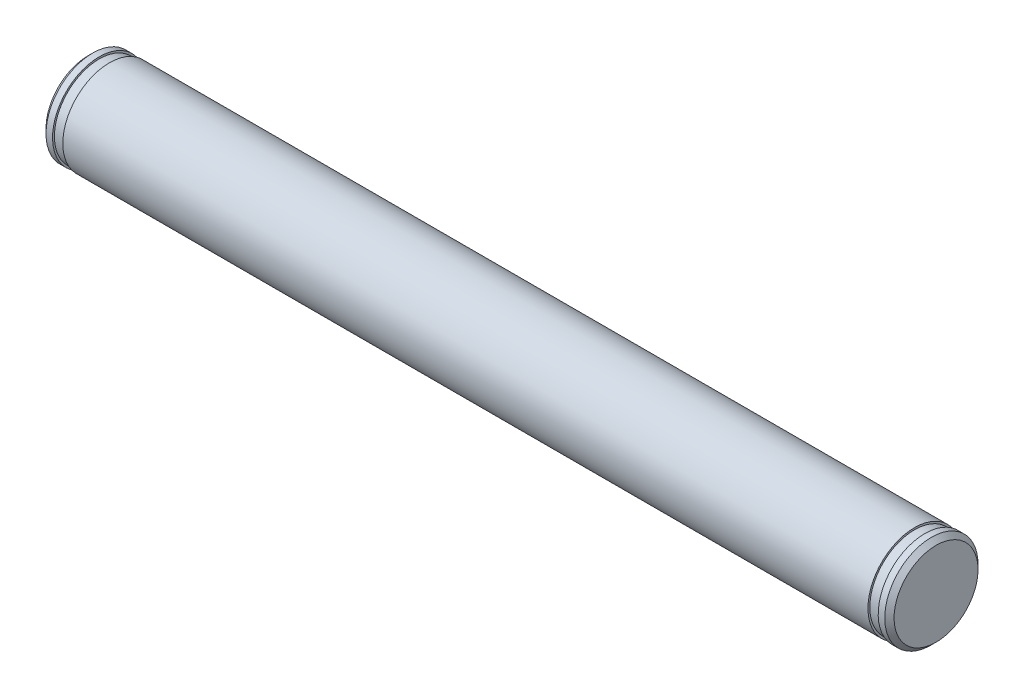
ISO-10303-21;
HEADER;
FILE_DESCRIPTION(('STEP AP214'),'2;1');
FILE_NAME('part.step','',(''),(''),'','','');
FILE_SCHEMA(('AUTOMOTIVE_DESIGN { 1 0 10303 214 1 1 1 1 }'));
ENDSEC;
DATA;
#1=APPLICATION_CONTEXT('core data for automotive mechanical design processes');
#2=APPLICATION_PROTOCOL_DEFINITION('international standard','automotive_design',2000,#1);
#3=PRODUCT_CONTEXT('',#1,'mechanical');
#4=PRODUCT('Part','Part','',(#3));
#5=PRODUCT_RELATED_PRODUCT_CATEGORY('part','',(#4));
#6=PRODUCT_DEFINITION_FORMATION('','',#4);
#7=PRODUCT_DEFINITION_CONTEXT('part definition',#1,'design');
#8=PRODUCT_DEFINITION('design','',#6,#7);
#9=PRODUCT_DEFINITION_SHAPE('','',#8);
#10=(LENGTH_UNIT() NAMED_UNIT(*) SI_UNIT(.MILLI.,.METRE.));
#11=(NAMED_UNIT(*) PLANE_ANGLE_UNIT() SI_UNIT($,.RADIAN.));
#12=(NAMED_UNIT(*) SI_UNIT($,.STERADIAN.) SOLID_ANGLE_UNIT());
#13=UNCERTAINTY_MEASURE_WITH_UNIT(LENGTH_MEASURE(1.E-05),#10,'distance_accuracy_value','');
#14=(GEOMETRIC_REPRESENTATION_CONTEXT(3) GLOBAL_UNCERTAINTY_ASSIGNED_CONTEXT((#13)) GLOBAL_UNIT_ASSIGNED_CONTEXT((#10,
#11,#12)) REPRESENTATION_CONTEXT('',''));
#15=CARTESIAN_POINT('',(0.,0.,0.));
#16=DIRECTION('',(0.,0.,1.));
#17=DIRECTION('',(1.,0.,0.));
#18=AXIS2_PLACEMENT_3D('',#15,#16,#17);
#19=CARTESIAN_POINT('',(-45.45,0.,0.));
#20=DIRECTION('',(-1.,0.,0.));
#21=DIRECTION('',(0.,-1.,0.));
#22=AXIS2_PLACEMENT_3D('',#19,#20,#21);
#23=PLANE('',#22);
#24=CARTESIAN_POINT('',(-45.45,0.,0.));
#25=DIRECTION('',(-1.,0.,0.));
#26=DIRECTION('',(0.,-1.,0.));
#27=AXIS2_PLACEMENT_3D('',#24,#25,#26);
#28=CIRCLE('',#27,4.49999999999999);
#29=CARTESIAN_POINT('',(-45.45,-4.49999999999999,0.));
#30=VERTEX_POINT('',#29);
#31=EDGE_CURVE('E10',#30,#30,#28,.T.);
#32=ORIENTED_EDGE('',*,*,#31,.T.);
#33=EDGE_LOOP('',(#32));
#34=FACE_BOUND('',#33,.T.);
#35=ADVANCED_FACE('F34',(#34),#23,.T.);
#36=CARTESIAN_POINT('',(45.45,0.,0.));
#37=DIRECTION('',(1.,0.,0.));
#38=DIRECTION('',(0.,1.,0.));
#39=AXIS2_PLACEMENT_3D('',#36,#37,#38);
#40=CYLINDRICAL_SURFACE('',#39,4.99999999999999);
#41=CARTESIAN_POINT('',(-44.95,0.,0.));
#42=DIRECTION('',(-1.,0.,0.));
#43=DIRECTION('',(0.,-1.,0.));
#44=AXIS2_PLACEMENT_3D('',#41,#42,#43);
#45=CIRCLE('',#44,4.99999999999999);
#46=CARTESIAN_POINT('',(-44.95,-4.99999999999999,0.));
#47=VERTEX_POINT('',#46);
#48=EDGE_CURVE('E42',#47,#47,#45,.F.);
#49=ORIENTED_EDGE('',*,*,#48,.T.);
#50=EDGE_LOOP('',(#49));
#51=FACE_BOUND('',#50,.T.);
#52=CARTESIAN_POINT('',(-44.25,0.,0.));
#53=DIRECTION('',(1.,0.,0.));
#54=DIRECTION('',(0.,1.,0.));
#55=AXIS2_PLACEMENT_3D('',#52,#53,#54);
#56=CIRCLE('',#55,4.99999999999999);
#57=CARTESIAN_POINT('',(-44.25,4.99999999999999,0.));
#58=VERTEX_POINT('',#57);
#59=EDGE_CURVE('E55',#58,#58,#56,.T.);
#60=ORIENTED_EDGE('',*,*,#59,.F.);
#61=EDGE_LOOP('',(#60));
#62=FACE_BOUND('',#61,.T.);
#63=ADVANCED_FACE('F98',(#51,#62),#40,.T.);
#64=CARTESIAN_POINT('',(-44.25,4.99999999999999,0.));
#65=DIRECTION('',(1.,0.,0.));
#66=DIRECTION('',(0.,1.,0.));
#67=AXIS2_PLACEMENT_3D('',#64,#65,#66);
#68=PLANE('',#67);
#69=ORIENTED_EDGE('',*,*,#59,.T.);
#70=EDGE_LOOP('',(#69));
#71=FACE_BOUND('',#70,.T.);
#72=CARTESIAN_POINT('',(-44.25,0.,0.));
#73=DIRECTION('',(1.,0.,0.));
#74=DIRECTION('',(0.,1.,0.));
#75=AXIS2_PLACEMENT_3D('',#72,#73,#74);
#76=CIRCLE('',#75,4.79999999999999);
#77=CARTESIAN_POINT('',(-44.25,4.79999999999999,0.));
#78=VERTEX_POINT('',#77);
#79=EDGE_CURVE('E58',#78,#78,#76,.T.);
#80=ORIENTED_EDGE('',*,*,#79,.F.);
#81=EDGE_LOOP('',(#80));
#82=FACE_BOUND('',#81,.T.);
#83=ADVANCED_FACE('F103',(#71,#82),#68,.T.);
#84=CARTESIAN_POINT('',(45.45,0.,0.));
#85=DIRECTION('',(1.,0.,0.));
#86=DIRECTION('',(0.,1.,0.));
#87=AXIS2_PLACEMENT_3D('',#84,#85,#86);
#88=CYLINDRICAL_SURFACE('',#87,4.79999999999999);
#89=ORIENTED_EDGE('',*,*,#79,.T.);
#90=EDGE_LOOP('',(#89));
#91=FACE_BOUND('',#90,.T.);
#92=CARTESIAN_POINT('',(-43.15,0.,0.));
#93=DIRECTION('',(1.,0.,0.));
#94=DIRECTION('',(0.,1.,0.));
#95=AXIS2_PLACEMENT_3D('',#92,#93,#94);
#96=CIRCLE('',#95,4.79999999999999);
#97=CARTESIAN_POINT('',(-43.15,4.79999999999999,0.));
#98=VERTEX_POINT('',#97);
#99=EDGE_CURVE('E61',#98,#98,#96,.T.);
#100=ORIENTED_EDGE('',*,*,#99,.F.);
#101=EDGE_LOOP('',(#100));
#102=FACE_BOUND('',#101,.T.);
#103=ADVANCED_FACE('F179',(#91,#102),#88,.T.);
#104=CARTESIAN_POINT('',(-43.15,4.79999999999999,0.));
#105=DIRECTION('',(-1.,0.,0.));
#106=DIRECTION('',(0.,-1.,0.));
#107=AXIS2_PLACEMENT_3D('',#104,#105,#106);
#108=PLANE('',#107);
#109=ORIENTED_EDGE('',*,*,#99,.T.);
#110=EDGE_LOOP('',(#109));
#111=FACE_BOUND('',#110,.T.);
#112=CARTESIAN_POINT('',(-43.15,0.,0.));
#113=DIRECTION('',(1.,0.,0.));
#114=DIRECTION('',(0.,1.,0.));
#115=AXIS2_PLACEMENT_3D('',#112,#113,#114);
#116=CIRCLE('',#115,4.99999999999999);
#117=CARTESIAN_POINT('',(-43.15,4.99999999999999,0.));
#118=VERTEX_POINT('',#117);
#119=EDGE_CURVE('E64',#118,#118,#116,.T.);
#120=ORIENTED_EDGE('',*,*,#119,.F.);
#121=EDGE_LOOP('',(#120));
#122=FACE_BOUND('',#121,.T.);
#123=ADVANCED_FACE('F169',(#111,#122),#108,.T.);
#124=CARTESIAN_POINT('',(45.45,0.,0.));
#125=DIRECTION('',(1.,0.,0.));
#126=DIRECTION('',(0.,1.,0.));
#127=AXIS2_PLACEMENT_3D('',#124,#125,#126);
#128=CYLINDRICAL_SURFACE('',#127,4.99999999999999);
#129=ORIENTED_EDGE('',*,*,#119,.T.);
#130=EDGE_LOOP('',(#129));
#131=FACE_BOUND('',#130,.T.);
#132=CARTESIAN_POINT('',(43.15,0.,0.));
#133=DIRECTION('',(1.,0.,0.));
#134=DIRECTION('',(0.,1.,0.));
#135=AXIS2_PLACEMENT_3D('',#132,#133,#134);
#136=CIRCLE('',#135,4.99999999999999);
#137=CARTESIAN_POINT('',(43.15,5.,0.));
#138=VERTEX_POINT('',#137);
#139=EDGE_CURVE('E67',#138,#138,#136,.T.);
#140=ORIENTED_EDGE('',*,*,#139,.F.);
#141=EDGE_LOOP('',(#140));
#142=FACE_BOUND('',#141,.T.);
#143=ADVANCED_FACE('F159',(#131,#142),#128,.T.);
#144=CARTESIAN_POINT('',(43.15,4.8,0.));
#145=DIRECTION('',(1.,0.,0.));
#146=DIRECTION('',(0.,1.,0.));
#147=AXIS2_PLACEMENT_3D('',#144,#145,#146);
#148=PLANE('',#147);
#149=ORIENTED_EDGE('',*,*,#139,.T.);
#150=EDGE_LOOP('',(#149));
#151=FACE_BOUND('',#150,.T.);
#152=CARTESIAN_POINT('',(43.15,0.,0.));
#153=DIRECTION('',(1.,0.,0.));
#154=DIRECTION('',(0.,1.,0.));
#155=AXIS2_PLACEMENT_3D('',#152,#153,#154);
#156=CIRCLE('',#155,4.79999999999999);
#157=CARTESIAN_POINT('',(43.15,4.8,0.));
#158=VERTEX_POINT('',#157);
#159=EDGE_CURVE('E70',#158,#158,#156,.T.);
#160=ORIENTED_EDGE('',*,*,#159,.F.);
#161=EDGE_LOOP('',(#160));
#162=FACE_BOUND('',#161,.T.);
#163=ADVANCED_FACE('F94',(#151,#162),#148,.T.);
#164=CARTESIAN_POINT('',(45.45,0.,0.));
#165=DIRECTION('',(1.,0.,0.));
#166=DIRECTION('',(0.,1.,0.));
#167=AXIS2_PLACEMENT_3D('',#164,#165,#166);
#168=CYLINDRICAL_SURFACE('',#167,4.79999999999999);
#169=ORIENTED_EDGE('',*,*,#159,.T.);
#170=EDGE_LOOP('',(#169));
#171=FACE_BOUND('',#170,.T.);
#172=CARTESIAN_POINT('',(44.25,0.,0.));
#173=DIRECTION('',(1.,0.,0.));
#174=DIRECTION('',(0.,1.,0.));
#175=AXIS2_PLACEMENT_3D('',#172,#173,#174);
#176=CIRCLE('',#175,4.79999999999999);
#177=CARTESIAN_POINT('',(44.25,4.8,0.));
#178=VERTEX_POINT('',#177);
#179=EDGE_CURVE('E73',#178,#178,#176,.T.);
#180=ORIENTED_EDGE('',*,*,#179,.F.);
#181=EDGE_LOOP('',(#180));
#182=FACE_BOUND('',#181,.T.);
#183=ADVANCED_FACE('F84',(#171,#182),#168,.T.);
#184=CARTESIAN_POINT('',(44.25,5.,0.));
#185=DIRECTION('',(-1.,0.,0.));
#186=DIRECTION('',(0.,-1.,0.));
#187=AXIS2_PLACEMENT_3D('',#184,#185,#186);
#188=PLANE('',#187);
#189=ORIENTED_EDGE('',*,*,#179,.T.);
#190=EDGE_LOOP('',(#189));
#191=FACE_BOUND('',#190,.T.);
#192=CARTESIAN_POINT('',(44.25,0.,0.));
#193=DIRECTION('',(1.,0.,0.));
#194=DIRECTION('',(0.,1.,0.));
#195=AXIS2_PLACEMENT_3D('',#192,#193,#194);
#196=CIRCLE('',#195,4.99999999999999);
#197=CARTESIAN_POINT('',(44.25,5.,0.));
#198=VERTEX_POINT('',#197);
#199=EDGE_CURVE('E76',#198,#198,#196,.T.);
#200=ORIENTED_EDGE('',*,*,#199,.F.);
#201=EDGE_LOOP('',(#200));
#202=FACE_BOUND('',#201,.T.);
#203=ADVANCED_FACE('F82',(#191,#202),#188,.T.);
#204=CARTESIAN_POINT('',(45.45,0.,0.));
#205=DIRECTION('',(1.,0.,0.));
#206=DIRECTION('',(0.,1.,0.));
#207=AXIS2_PLACEMENT_3D('',#204,#205,#206);
#208=CYLINDRICAL_SURFACE('',#207,4.99999999999999);
#209=CARTESIAN_POINT('',(44.95,0.,0.));
#210=DIRECTION('',(1.,0.,0.));
#211=DIRECTION('',(0.,1.,0.));
#212=AXIS2_PLACEMENT_3D('',#209,#210,#211);
#213=CIRCLE('',#212,4.99999999999999);
#214=CARTESIAN_POINT('',(44.95,5.,0.));
#215=VERTEX_POINT('',#214);
#216=EDGE_CURVE('E46',#215,#215,#213,.F.);
#217=ORIENTED_EDGE('',*,*,#216,.T.);
#218=EDGE_LOOP('',(#217));
#219=FACE_BOUND('',#218,.T.);
#220=ORIENTED_EDGE('',*,*,#199,.T.);
#221=EDGE_LOOP('',(#220));
#222=FACE_BOUND('',#221,.T.);
#223=ADVANCED_FACE('F80',(#219,#222),#208,.T.);
#224=CARTESIAN_POINT('',(45.45,0.,0.));
#225=DIRECTION('',(1.,0.,0.));
#226=DIRECTION('',(0.,1.,0.));
#227=AXIS2_PLACEMENT_3D('',#224,#225,#226);
#228=PLANE('',#227);
#229=CARTESIAN_POINT('',(45.45,0.,0.));
#230=DIRECTION('',(1.,0.,0.));
#231=DIRECTION('',(0.,1.,0.));
#232=AXIS2_PLACEMENT_3D('',#229,#230,#231);
#233=CIRCLE('',#232,4.49999999999998);
#234=CARTESIAN_POINT('',(45.45,4.49999999999999,0.));
#235=VERTEX_POINT('',#234);
#236=EDGE_CURVE('E50',#235,#235,#233,.T.);
#237=ORIENTED_EDGE('',*,*,#236,.T.);
#238=EDGE_LOOP('',(#237));
#239=FACE_BOUND('',#238,.T.);
#240=ADVANCED_FACE('F91',(#239),#228,.T.);
#241=CARTESIAN_POINT('',(45.45,0.,0.));
#242=DIRECTION('',(-1.,0.,0.));
#243=DIRECTION('',(0.,-1.,0.));
#244=AXIS2_PLACEMENT_3D('',#241,#242,#243);
#245=CONICAL_SURFACE('',#244,4.49999999999998,0.785398163397446);
#246=ORIENTED_EDGE('',*,*,#216,.F.);
#247=EDGE_LOOP('',(#246));
#248=FACE_BOUND('',#247,.T.);
#249=ORIENTED_EDGE('',*,*,#236,.F.);
#250=EDGE_LOOP('',(#249));
#251=FACE_BOUND('',#250,.T.);
#252=ADVANCED_FACE('F107',(#248,#251),#245,.T.);
#253=CARTESIAN_POINT('',(-44.95,0.,0.));
#254=DIRECTION('',(1.,0.,0.));
#255=DIRECTION('',(0.,1.,0.));
#256=AXIS2_PLACEMENT_3D('',#253,#254,#255);
#257=CONICAL_SURFACE('',#256,4.99999999999999,0.785398163397446);
#258=ORIENTED_EDGE('',*,*,#31,.F.);
#259=EDGE_LOOP('',(#258));
#260=FACE_BOUND('',#259,.T.);
#261=ORIENTED_EDGE('',*,*,#48,.F.);
#262=EDGE_LOOP('',(#261));
#263=FACE_BOUND('',#262,.T.);
#264=ADVANCED_FACE('F37',(#260,#263),#257,.T.);
#265=CLOSED_SHELL('',(#35,#63,#83,#103,#123,#143,#163,#183,#203,#223,#240,#252,#264));
#266=MANIFOLD_SOLID_BREP('B2',#265);
#267=ADVANCED_BREP_SHAPE_REPRESENTATION('',(#18,#266),#14);
#268=SHAPE_DEFINITION_REPRESENTATION(#9,#267);
ENDSEC;
END-ISO-10303-21;
